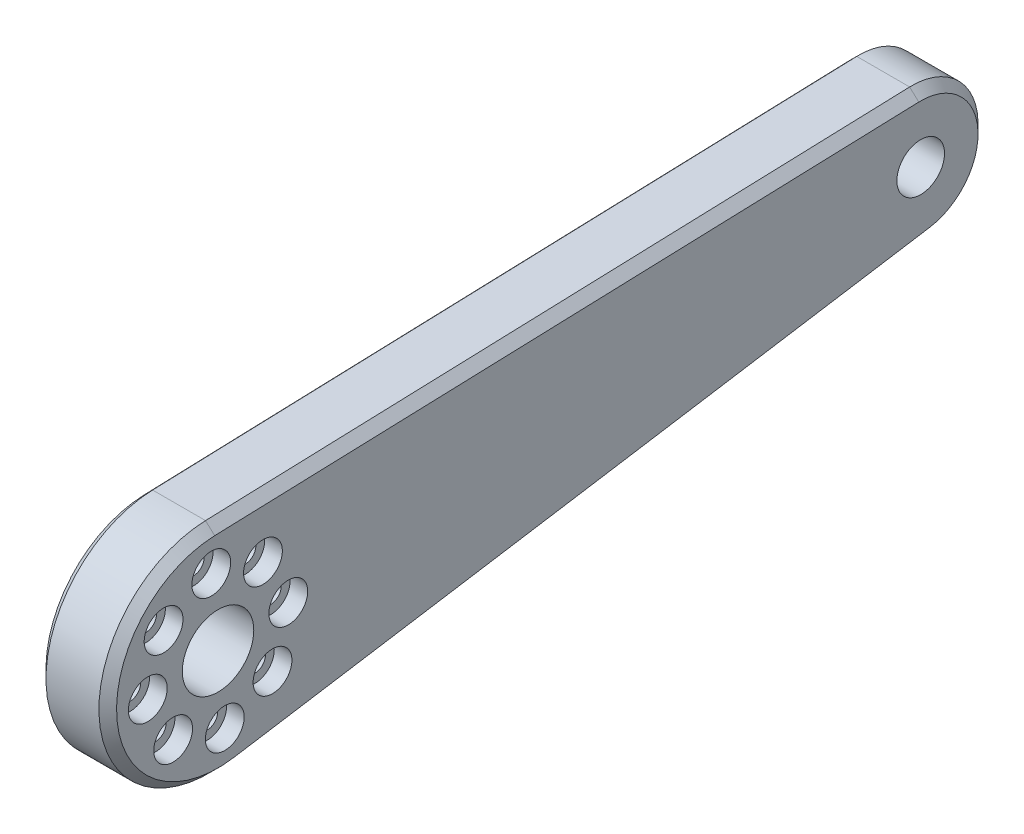
ISO-10303-21;
HEADER;
FILE_DESCRIPTION(('STEP AP214'),'2;1');
FILE_NAME('part.step','',(''),(''),'','','');
FILE_SCHEMA(('AUTOMOTIVE_DESIGN { 1 0 10303 214 1 1 1 1 }'));
ENDSEC;
DATA;
#1=APPLICATION_CONTEXT('core data for automotive mechanical design processes');
#2=APPLICATION_PROTOCOL_DEFINITION('international standard','automotive_design',2000,#1);
#3=PRODUCT_CONTEXT('',#1,'mechanical');
#4=PRODUCT('Part','Part','',(#3));
#5=PRODUCT_RELATED_PRODUCT_CATEGORY('part','',(#4));
#6=PRODUCT_DEFINITION_FORMATION('','',#4);
#7=PRODUCT_DEFINITION_CONTEXT('part definition',#1,'design');
#8=PRODUCT_DEFINITION('design','',#6,#7);
#9=PRODUCT_DEFINITION_SHAPE('','',#8);
#10=(LENGTH_UNIT() NAMED_UNIT(*) SI_UNIT(.MILLI.,.METRE.));
#11=(NAMED_UNIT(*) PLANE_ANGLE_UNIT() SI_UNIT($,.RADIAN.));
#12=(NAMED_UNIT(*) SI_UNIT($,.STERADIAN.) SOLID_ANGLE_UNIT());
#13=UNCERTAINTY_MEASURE_WITH_UNIT(LENGTH_MEASURE(1.E-05),#10,'distance_accuracy_value','');
#14=(GEOMETRIC_REPRESENTATION_CONTEXT(3) GLOBAL_UNCERTAINTY_ASSIGNED_CONTEXT((#13)) GLOBAL_UNIT_ASSIGNED_CONTEXT((#10,
#11,#12)) REPRESENTATION_CONTEXT('',''));
#15=CARTESIAN_POINT('',(0.,0.,0.));
#16=DIRECTION('',(0.,0.,1.));
#17=DIRECTION('',(1.,0.,0.));
#18=AXIS2_PLACEMENT_3D('',#15,#16,#17);
#19=CARTESIAN_POINT('',(8.,0.,0.));
#20=DIRECTION('',(1.,0.,0.));
#21=DIRECTION('',(0.,0.,-1.));
#22=AXIS2_PLACEMENT_3D('',#19,#20,#21);
#23=PLANE('',#22);
#24=CARTESIAN_POINT('',(8.,0.,0.));
#25=DIRECTION('',(1.,0.,0.));
#26=DIRECTION('',(0.,0.,-1.));
#27=AXIS2_PLACEMENT_3D('',#24,#25,#26);
#28=CIRCLE('',#27,11.5);
#29=CARTESIAN_POINT('',(8.,11.4936095629883,0.38332651041252));
#30=VERTEX_POINT('',#29);
#31=CARTESIAN_POINT('',(8.,-11.3559936016208,-1.81422416474595));
#32=VERTEX_POINT('',#31);
#33=EDGE_CURVE('E61',#30,#32,#28,.T.);
#34=ORIENTED_EDGE('',*,*,#33,.T.);
#35=DIRECTION('',(0.,0.157758623021387,-0.987477704488763));
#36=VECTOR('',#35,1.);
#37=CARTESIAN_POINT('',(8.,1.2400223360567,-80.6579961603689));
#38=LINE('',#37,#36);
#39=CARTESIAN_POINT('',(8.,1.24002233605671,-80.6579961603689));
#40=VERTEX_POINT('',#39);
#41=EDGE_CURVE('E11',#32,#40,#38,.T.);
#42=ORIENTED_EDGE('',*,*,#41,.T.);
#43=CARTESIAN_POINT('',(8.,7.65862741523368,-79.6325651107299));
#44=DIRECTION('',(1.,0.,0.));
#45=DIRECTION('',(0.,0.,-1.));
#46=AXIS2_PLACEMENT_3D('',#43,#44,#45);
#47=CIRCLE('',#46,6.50000000000002);
#48=CARTESIAN_POINT('',(8.,14.1550154290966,-79.4159023004967));
#49=VERTEX_POINT('',#48);
#50=EDGE_CURVE('E46',#40,#49,#47,.T.);
#51=ORIENTED_EDGE('',*,*,#50,.T.);
#52=DIRECTION('',(0.,-0.0333327400358713,0.999444309825065));
#53=VECTOR('',#52,1.);
#54=CARTESIAN_POINT('',(8.,11.4936095629883,0.38332651041252));
#55=LINE('',#54,#53);
#56=EDGE_CURVE('E297',#49,#30,#55,.T.);
#57=ORIENTED_EDGE('',*,*,#56,.T.);
#58=EDGE_LOOP('',(#34,#42,#51,#57));
#59=FACE_BOUND('',#58,.T.);
#60=CARTESIAN_POINT('',(8.,0.765862741523368,-7.96325651107299));
#61=DIRECTION('',(1.,0.,0.));
#62=DIRECTION('',(0.,0.,-1.));
#63=AXIS2_PLACEMENT_3D('',#60,#61,#62);
#64=CIRCLE('',#63,2.2);
#65=CARTESIAN_POINT('',(8.,0.765862741523368,-10.163256511073));
#66=VERTEX_POINT('',#65);
#67=EDGE_CURVE('E159',#66,#66,#64,.T.);
#68=ORIENTED_EDGE('',*,*,#67,.F.);
#69=EDGE_LOOP('',(#68));
#70=FACE_BOUND('',#69,.T.);
#71=CARTESIAN_POINT('',(8.,-5.08932594131834,-6.17241941729693));
#72=DIRECTION('',(1.,0.,0.));
#73=DIRECTION('',(0.,0.,-1.));
#74=AXIS2_PLACEMENT_3D('',#71,#72,#73);
#75=CIRCLE('',#74,2.2);
#76=CARTESIAN_POINT('',(8.,-5.08932594131834,-8.37241941729693));
#77=VERTEX_POINT('',#76);
#78=EDGE_CURVE('E178',#77,#77,#75,.T.);
#79=ORIENTED_EDGE('',*,*,#78,.F.);
#80=EDGE_LOOP('',(#79));
#81=FACE_BOUND('',#80,.T.);
#82=CARTESIAN_POINT('',(8.,-7.96325651107299,-0.765862741523369));
#83=DIRECTION('',(1.,0.,0.));
#84=DIRECTION('',(0.,0.,-1.));
#85=AXIS2_PLACEMENT_3D('',#82,#83,#84);
#86=CIRCLE('',#85,2.2);
#87=CARTESIAN_POINT('',(8.,-7.96325651107299,-2.96586274152337));
#88=VERTEX_POINT('',#87);
#89=EDGE_CURVE('E190',#88,#88,#86,.T.);
#90=ORIENTED_EDGE('',*,*,#89,.F.);
#91=EDGE_LOOP('',(#90));
#92=FACE_BOUND('',#91,.T.);
#93=CARTESIAN_POINT('',(8.,-6.17241941729693,5.08932594131834));
#94=DIRECTION('',(1.,0.,0.));
#95=DIRECTION('',(0.,0.,-1.));
#96=AXIS2_PLACEMENT_3D('',#93,#94,#95);
#97=CIRCLE('',#96,2.2);
#98=CARTESIAN_POINT('',(8.,-6.17241941729693,2.88932594131834));
#99=VERTEX_POINT('',#98);
#100=EDGE_CURVE('E202',#99,#99,#97,.T.);
#101=ORIENTED_EDGE('',*,*,#100,.F.);
#102=EDGE_LOOP('',(#101));
#103=FACE_BOUND('',#102,.T.);
#104=CARTESIAN_POINT('',(8.,-0.765862741523369,7.96325651107299));
#105=DIRECTION('',(1.,0.,0.));
#106=DIRECTION('',(0.,0.,-1.));
#107=AXIS2_PLACEMENT_3D('',#104,#105,#106);
#108=CIRCLE('',#107,2.2);
#109=CARTESIAN_POINT('',(8.,-0.765862741523369,5.76325651107299));
#110=VERTEX_POINT('',#109);
#111=EDGE_CURVE('E214',#110,#110,#108,.T.);
#112=ORIENTED_EDGE('',*,*,#111,.F.);
#113=EDGE_LOOP('',(#112));
#114=FACE_BOUND('',#113,.T.);
#115=CARTESIAN_POINT('',(8.,5.08932594131834,6.17241941729693));
#116=DIRECTION('',(1.,0.,0.));
#117=DIRECTION('',(0.,0.,-1.));
#118=AXIS2_PLACEMENT_3D('',#115,#116,#117);
#119=CIRCLE('',#118,2.2);
#120=CARTESIAN_POINT('',(8.,5.08932594131834,3.97241941729693));
#121=VERTEX_POINT('',#120);
#122=EDGE_CURVE('E226',#121,#121,#119,.T.);
#123=ORIENTED_EDGE('',*,*,#122,.F.);
#124=EDGE_LOOP('',(#123));
#125=FACE_BOUND('',#124,.T.);
#126=CARTESIAN_POINT('',(8.,7.96325651107299,0.76586274152337));
#127=DIRECTION('',(1.,0.,0.));
#128=DIRECTION('',(0.,0.,-1.));
#129=AXIS2_PLACEMENT_3D('',#126,#127,#128);
#130=CIRCLE('',#129,2.2);
#131=CARTESIAN_POINT('',(8.,7.96325651107299,-1.43413725847663));
#132=VERTEX_POINT('',#131);
#133=EDGE_CURVE('E238',#132,#132,#130,.T.);
#134=ORIENTED_EDGE('',*,*,#133,.F.);
#135=EDGE_LOOP('',(#134));
#136=FACE_BOUND('',#135,.T.);
#137=CARTESIAN_POINT('',(8.,6.17241941729693,-5.08932594131834));
#138=DIRECTION('',(1.,0.,0.));
#139=DIRECTION('',(0.,0.,-1.));
#140=AXIS2_PLACEMENT_3D('',#137,#138,#139);
#141=CIRCLE('',#140,2.2);
#142=CARTESIAN_POINT('',(8.,6.17241941729693,-7.28932594131834));
#143=VERTEX_POINT('',#142);
#144=EDGE_CURVE('E250',#143,#143,#141,.T.);
#145=ORIENTED_EDGE('',*,*,#144,.F.);
#146=EDGE_LOOP('',(#145));
#147=FACE_BOUND('',#146,.T.);
#148=CARTESIAN_POINT('',(8.,7.65862741523368,-79.6325651107299));
#149=DIRECTION('',(1.,0.,0.));
#150=DIRECTION('',(0.,0.,-1.));
#151=AXIS2_PLACEMENT_3D('',#148,#149,#150);
#152=CIRCLE('',#151,2.7);
#153=CARTESIAN_POINT('',(8.,7.65862741523368,-82.3325651107298));
#154=VERTEX_POINT('',#153);
#155=EDGE_CURVE('E269',#154,#154,#152,.T.);
#156=ORIENTED_EDGE('',*,*,#155,.F.);
#157=EDGE_LOOP('',(#156));
#158=FACE_BOUND('',#157,.T.);
#159=CARTESIAN_POINT('',(8.,0.,0.));
#160=DIRECTION('',(1.,0.,0.));
#161=DIRECTION('',(0.,0.,-1.));
#162=AXIS2_PLACEMENT_3D('',#159,#160,#161);
#163=CIRCLE('',#162,4.05);
#164=CARTESIAN_POINT('',(8.,0.,-4.05));
#165=VERTEX_POINT('',#164);
#166=EDGE_CURVE('E263',#165,#165,#163,.T.);
#167=ORIENTED_EDGE('',*,*,#166,.F.);
#168=EDGE_LOOP('',(#167));
#169=FACE_BOUND('',#168,.T.);
#170=ADVANCED_FACE('F36',(#59,#70,#81,#92,#103,#114,#125,#136,#147,#158,#169),#23,.T.);
#171=CARTESIAN_POINT('',(0.,0.,0.));
#172=DIRECTION('',(1.,0.,0.));
#173=DIRECTION('',(0.,0.,-1.));
#174=AXIS2_PLACEMENT_3D('',#171,#172,#173);
#175=PLANE('',#174);
#176=CARTESIAN_POINT('',(0.,7.65862741523368,-79.6325651107299));
#177=DIRECTION('',(1.,0.,0.));
#178=DIRECTION('',(0.,0.,-1.));
#179=AXIS2_PLACEMENT_3D('',#176,#177,#178);
#180=CIRCLE('',#179,6.50000000000001);
#181=CARTESIAN_POINT('',(0.,14.1550154290966,-79.4159023004967));
#182=VERTEX_POINT('',#181);
#183=CARTESIAN_POINT('',(0.,1.24002233605672,-80.6579961603689));
#184=VERTEX_POINT('',#183);
#185=EDGE_CURVE('E284',#182,#184,#180,.F.);
#186=ORIENTED_EDGE('',*,*,#185,.T.);
#187=DIRECTION('',(0.,-0.157758623021387,0.987477704488763));
#188=VECTOR('',#187,1.);
#189=CARTESIAN_POINT('',(0.,-11.3559936016208,-1.81422416474595));
#190=LINE('',#189,#188);
#191=CARTESIAN_POINT('',(0.,-11.3559936016208,-1.81422416474595));
#192=VERTEX_POINT('',#191);
#193=EDGE_CURVE('E117',#184,#192,#190,.T.);
#194=ORIENTED_EDGE('',*,*,#193,.T.);
#195=CARTESIAN_POINT('',(0.,0.,0.));
#196=DIRECTION('',(1.,0.,0.));
#197=DIRECTION('',(0.,0.,-1.));
#198=AXIS2_PLACEMENT_3D('',#195,#196,#197);
#199=CIRCLE('',#198,11.5);
#200=CARTESIAN_POINT('',(0.,11.4936095629883,0.38332651041252));
#201=VERTEX_POINT('',#200);
#202=EDGE_CURVE('E282',#192,#201,#199,.F.);
#203=ORIENTED_EDGE('',*,*,#202,.T.);
#204=DIRECTION('',(0.,0.0333327400358713,-0.999444309825065));
#205=VECTOR('',#204,1.);
#206=CARTESIAN_POINT('',(0.,11.4936095629883,0.38332651041252));
#207=LINE('',#206,#205);
#208=EDGE_CURVE('E280',#201,#182,#207,.T.);
#209=ORIENTED_EDGE('',*,*,#208,.T.);
#210=EDGE_LOOP('',(#186,#194,#203,#209));
#211=FACE_BOUND('',#210,.T.);
#212=CARTESIAN_POINT('',(0.,0.765862741523368,-7.96325651107299));
#213=DIRECTION('',(1.,0.,0.));
#214=DIRECTION('',(0.,0.,-1.));
#215=AXIS2_PLACEMENT_3D('',#212,#213,#214);
#216=CIRCLE('',#215,1.2);
#217=CARTESIAN_POINT('',(0.,0.765862741523368,-9.16325651107299));
#218=VERTEX_POINT('',#217);
#219=EDGE_CURVE('E175',#218,#218,#216,.T.);
#220=ORIENTED_EDGE('',*,*,#219,.T.);
#221=EDGE_LOOP('',(#220));
#222=FACE_BOUND('',#221,.T.);
#223=CARTESIAN_POINT('',(0.,-5.08932594131834,-6.17241941729693));
#224=DIRECTION('',(1.,0.,0.));
#225=DIRECTION('',(0.,0.,-1.));
#226=AXIS2_PLACEMENT_3D('',#223,#224,#225);
#227=CIRCLE('',#226,1.2);
#228=CARTESIAN_POINT('',(0.,-5.08932594131834,-7.37241941729693));
#229=VERTEX_POINT('',#228);
#230=EDGE_CURVE('E187',#229,#229,#227,.T.);
#231=ORIENTED_EDGE('',*,*,#230,.T.);
#232=EDGE_LOOP('',(#231));
#233=FACE_BOUND('',#232,.T.);
#234=CARTESIAN_POINT('',(0.,-7.96325651107299,-0.765862741523369));
#235=DIRECTION('',(1.,0.,0.));
#236=DIRECTION('',(0.,0.,-1.));
#237=AXIS2_PLACEMENT_3D('',#234,#235,#236);
#238=CIRCLE('',#237,1.2);
#239=CARTESIAN_POINT('',(0.,-7.96325651107299,-1.96586274152337));
#240=VERTEX_POINT('',#239);
#241=EDGE_CURVE('E199',#240,#240,#238,.T.);
#242=ORIENTED_EDGE('',*,*,#241,.T.);
#243=EDGE_LOOP('',(#242));
#244=FACE_BOUND('',#243,.T.);
#245=CARTESIAN_POINT('',(0.,-6.17241941729693,5.08932594131834));
#246=DIRECTION('',(1.,0.,0.));
#247=DIRECTION('',(0.,0.,-1.));
#248=AXIS2_PLACEMENT_3D('',#245,#246,#247);
#249=CIRCLE('',#248,1.2);
#250=CARTESIAN_POINT('',(0.,-6.17241941729693,3.88932594131834));
#251=VERTEX_POINT('',#250);
#252=EDGE_CURVE('E211',#251,#251,#249,.T.);
#253=ORIENTED_EDGE('',*,*,#252,.T.);
#254=EDGE_LOOP('',(#253));
#255=FACE_BOUND('',#254,.T.);
#256=CARTESIAN_POINT('',(0.,-0.765862741523369,7.96325651107299));
#257=DIRECTION('',(1.,0.,0.));
#258=DIRECTION('',(0.,0.,-1.));
#259=AXIS2_PLACEMENT_3D('',#256,#257,#258);
#260=CIRCLE('',#259,1.2);
#261=CARTESIAN_POINT('',(0.,-0.765862741523369,6.76325651107299));
#262=VERTEX_POINT('',#261);
#263=EDGE_CURVE('E223',#262,#262,#260,.T.);
#264=ORIENTED_EDGE('',*,*,#263,.T.);
#265=EDGE_LOOP('',(#264));
#266=FACE_BOUND('',#265,.T.);
#267=CARTESIAN_POINT('',(0.,5.08932594131834,6.17241941729693));
#268=DIRECTION('',(1.,0.,0.));
#269=DIRECTION('',(0.,0.,-1.));
#270=AXIS2_PLACEMENT_3D('',#267,#268,#269);
#271=CIRCLE('',#270,1.2);
#272=CARTESIAN_POINT('',(0.,5.08932594131834,4.97241941729693));
#273=VERTEX_POINT('',#272);
#274=EDGE_CURVE('E235',#273,#273,#271,.T.);
#275=ORIENTED_EDGE('',*,*,#274,.T.);
#276=EDGE_LOOP('',(#275));
#277=FACE_BOUND('',#276,.T.);
#278=CARTESIAN_POINT('',(0.,7.96325651107299,0.76586274152337));
#279=DIRECTION('',(1.,0.,0.));
#280=DIRECTION('',(0.,0.,-1.));
#281=AXIS2_PLACEMENT_3D('',#278,#279,#280);
#282=CIRCLE('',#281,1.2);
#283=CARTESIAN_POINT('',(0.,7.96325651107299,-0.434137258476628));
#284=VERTEX_POINT('',#283);
#285=EDGE_CURVE('E247',#284,#284,#282,.T.);
#286=ORIENTED_EDGE('',*,*,#285,.T.);
#287=EDGE_LOOP('',(#286));
#288=FACE_BOUND('',#287,.T.);
#289=CARTESIAN_POINT('',(0.,6.17241941729693,-5.08932594131834));
#290=DIRECTION('',(1.,0.,0.));
#291=DIRECTION('',(0.,0.,-1.));
#292=AXIS2_PLACEMENT_3D('',#289,#290,#291);
#293=CIRCLE('',#292,1.2);
#294=CARTESIAN_POINT('',(0.,6.17241941729693,-6.28932594131834));
#295=VERTEX_POINT('',#294);
#296=EDGE_CURVE('E259',#295,#295,#293,.T.);
#297=ORIENTED_EDGE('',*,*,#296,.T.);
#298=EDGE_LOOP('',(#297));
#299=FACE_BOUND('',#298,.T.);
#300=CARTESIAN_POINT('',(0.,7.65862741523368,-79.6325651107299));
#301=DIRECTION('',(1.,0.,0.));
#302=DIRECTION('',(0.,0.,-1.));
#303=AXIS2_PLACEMENT_3D('',#300,#301,#302);
#304=CIRCLE('',#303,2.7);
#305=CARTESIAN_POINT('',(0.,7.65862741523368,-82.3325651107298));
#306=VERTEX_POINT('',#305);
#307=EDGE_CURVE('E266',#306,#306,#304,.T.);
#308=ORIENTED_EDGE('',*,*,#307,.T.);
#309=EDGE_LOOP('',(#308));
#310=FACE_BOUND('',#309,.T.);
#311=CARTESIAN_POINT('',(0.,0.,0.));
#312=DIRECTION('',(1.,0.,0.));
#313=DIRECTION('',(0.,0.,-1.));
#314=AXIS2_PLACEMENT_3D('',#311,#312,#313);
#315=CIRCLE('',#314,4.05);
#316=CARTESIAN_POINT('',(0.,0.,-4.05));
#317=VERTEX_POINT('',#316);
#318=EDGE_CURVE('E262',#317,#317,#315,.T.);
#319=ORIENTED_EDGE('',*,*,#318,.T.);
#320=EDGE_LOOP('',(#319));
#321=FACE_BOUND('',#320,.T.);
#322=ADVANCED_FACE('F328',(#211,#222,#233,#244,#255,#266,#277,#288,#299,#310,#321),#175,.F.);
#323=CARTESIAN_POINT('',(8.,0.,0.));
#324=DIRECTION('',(-1.,0.,0.));
#325=DIRECTION('',(0.,0.,1.));
#326=AXIS2_PLACEMENT_3D('',#323,#324,#325);
#327=CYLINDRICAL_SURFACE('',#326,12.5);
#328=DIRECTION('',(-1.,0.,0.));
#329=VECTOR('',#328,1.);
#330=CARTESIAN_POINT('',(8.,12.4930538728133,0.416659250448391));
#331=LINE('',#330,#329);
#332=CARTESIAN_POINT('',(7.00000000000001,12.4930538728133,0.416659250448391));
#333=VERTEX_POINT('',#332);
#334=CARTESIAN_POINT('',(1.,12.4930538728133,0.416659250448391));
#335=VERTEX_POINT('',#334);
#336=EDGE_CURVE('E272',#333,#335,#331,.T.);
#337=ORIENTED_EDGE('',*,*,#336,.T.);
#338=CARTESIAN_POINT('',(1.,0.,0.));
#339=DIRECTION('',(1.,0.,0.));
#340=DIRECTION('',(0.,0.,-1.));
#341=AXIS2_PLACEMENT_3D('',#338,#339,#340);
#342=CIRCLE('',#341,12.5);
#343=CARTESIAN_POINT('',(1.,-12.3434713061095,-1.97198278776734));
#344=VERTEX_POINT('',#343);
#345=EDGE_CURVE('E291',#335,#344,#342,.T.);
#346=ORIENTED_EDGE('',*,*,#345,.T.);
#347=DIRECTION('',(-1.,0.,0.));
#348=VECTOR('',#347,1.);
#349=CARTESIAN_POINT('',(8.,-12.3434713061095,-1.97198278776734));
#350=LINE('',#349,#348);
#351=CARTESIAN_POINT('',(7.00000000000001,-12.3434713061095,-1.97198278776734));
#352=VERTEX_POINT('',#351);
#353=EDGE_CURVE('E128',#352,#344,#350,.T.);
#354=ORIENTED_EDGE('',*,*,#353,.F.);
#355=CARTESIAN_POINT('',(7.00000000000001,0.,0.));
#356=DIRECTION('',(1.,0.,0.));
#357=DIRECTION('',(0.,0.,-1.));
#358=AXIS2_PLACEMENT_3D('',#355,#356,#357);
#359=CIRCLE('',#358,12.5);
#360=EDGE_CURVE('E289',#352,#333,#359,.F.);
#361=ORIENTED_EDGE('',*,*,#360,.T.);
#362=EDGE_LOOP('',(#337,#346,#354,#361));
#363=FACE_BOUND('',#362,.T.);
#364=ADVANCED_FACE('F306',(#363),#327,.T.);
#365=CARTESIAN_POINT('',(8.,-12.3434713061095,-1.97198278776734));
#366=DIRECTION('',(0.,0.987477704488762,0.157758623021387));
#367=DIRECTION('',(0.,-0.157758623021387,0.987477704488763));
#368=AXIS2_PLACEMENT_3D('',#365,#366,#367);
#369=PLANE('',#368);
#370=ORIENTED_EDGE('',*,*,#353,.T.);
#371=DIRECTION('',(0.,0.157758623021387,-0.987477704488763));
#372=VECTOR('',#371,1.);
#373=CARTESIAN_POINT('',(0.999999999999999,-12.3434713061095,-1.97198278776734));
#374=LINE('',#373,#372);
#375=CARTESIAN_POINT('',(1.,0.252544631567964,-80.8157547833903));
#376=VERTEX_POINT('',#375);
#377=EDGE_CURVE('E127',#344,#376,#374,.T.);
#378=ORIENTED_EDGE('',*,*,#377,.T.);
#379=DIRECTION('',(-1.,0.,0.));
#380=VECTOR('',#379,1.);
#381=CARTESIAN_POINT('',(8.,0.252544631567964,-80.8157547833903));
#382=LINE('',#381,#380);
#383=CARTESIAN_POINT('',(7.00000000000001,0.252544631567964,-80.8157547833903));
#384=VERTEX_POINT('',#383);
#385=EDGE_CURVE('E110',#384,#376,#382,.T.);
#386=ORIENTED_EDGE('',*,*,#385,.F.);
#387=DIRECTION('',(0.,-0.157758623021387,0.987477704488763));
#388=VECTOR('',#387,1.);
#389=CARTESIAN_POINT('',(7.00000000000001,-12.3434713061095,-1.97198278776734));
#390=LINE('',#389,#388);
#391=EDGE_CURVE('E124',#384,#352,#390,.T.);
#392=ORIENTED_EDGE('',*,*,#391,.T.);
#393=EDGE_LOOP('',(#370,#378,#386,#392));
#394=FACE_BOUND('',#393,.T.);
#395=ADVANCED_FACE('F123',(#394),#369,.F.);
#396=CARTESIAN_POINT('',(8.,7.65862741523368,-79.6325651107299));
#397=DIRECTION('',(-1.,0.,0.));
#398=DIRECTION('',(0.,0.,1.));
#399=AXIS2_PLACEMENT_3D('',#396,#397,#398);
#400=CYLINDRICAL_SURFACE('',#399,7.5);
#401=ORIENTED_EDGE('',*,*,#385,.T.);
#402=CARTESIAN_POINT('',(1.,7.65862741523368,-79.6325651107299));
#403=DIRECTION('',(1.,0.,0.));
#404=DIRECTION('',(0.,0.,-1.));
#405=AXIS2_PLACEMENT_3D('',#402,#403,#404);
#406=CIRCLE('',#405,7.5);
#407=CARTESIAN_POINT('',(1.,15.1544597389217,-79.3825695604608));
#408=VERTEX_POINT('',#407);
#409=EDGE_CURVE('E116',#376,#408,#406,.T.);
#410=ORIENTED_EDGE('',*,*,#409,.T.);
#411=DIRECTION('',(-1.,0.,0.));
#412=VECTOR('',#411,1.);
#413=CARTESIAN_POINT('',(8.,15.1544597389217,-79.3825695604608));
#414=LINE('',#413,#412);
#415=CARTESIAN_POINT('',(7.00000000000001,15.1544597389217,-79.3825695604608));
#416=VERTEX_POINT('',#415);
#417=EDGE_CURVE('E112',#416,#408,#414,.T.);
#418=ORIENTED_EDGE('',*,*,#417,.F.);
#419=CARTESIAN_POINT('',(7.00000000000001,7.65862741523368,-79.6325651107299));
#420=DIRECTION('',(1.,0.,0.));
#421=DIRECTION('',(0.,0.,-1.));
#422=AXIS2_PLACEMENT_3D('',#419,#420,#421);
#423=CIRCLE('',#422,7.5);
#424=EDGE_CURVE('E107',#416,#384,#423,.F.);
#425=ORIENTED_EDGE('',*,*,#424,.T.);
#426=EDGE_LOOP('',(#401,#410,#418,#425));
#427=FACE_BOUND('',#426,.T.);
#428=ADVANCED_FACE('F109',(#427),#400,.T.);
#429=CARTESIAN_POINT('',(8.,12.4930538728133,0.416659250448391));
#430=DIRECTION('',(0.,-0.999444309825065,-0.0333327400358713));
#431=DIRECTION('',(0.,0.0333327400358713,-0.999444309825065));
#432=AXIS2_PLACEMENT_3D('',#429,#430,#431);
#433=PLANE('',#432);
#434=ORIENTED_EDGE('',*,*,#417,.T.);
#435=DIRECTION('',(0.,-0.0333327400358713,0.999444309825065));
#436=VECTOR('',#435,1.);
#437=CARTESIAN_POINT('',(1.,12.4930538728133,0.416659250448391));
#438=LINE('',#437,#436);
#439=EDGE_CURVE('E295',#408,#335,#438,.T.);
#440=ORIENTED_EDGE('',*,*,#439,.T.);
#441=ORIENTED_EDGE('',*,*,#336,.F.);
#442=DIRECTION('',(0.,0.0333327400358713,-0.999444309825065));
#443=VECTOR('',#442,1.);
#444=CARTESIAN_POINT('',(7.00000000000001,15.1544597389217,-79.3825695604608));
#445=LINE('',#444,#443);
#446=EDGE_CURVE('E293',#333,#416,#445,.T.);
#447=ORIENTED_EDGE('',*,*,#446,.T.);
#448=EDGE_LOOP('',(#434,#440,#441,#447));
#449=FACE_BOUND('',#448,.T.);
#450=ADVANCED_FACE('F308',(#449),#433,.F.);
#451=CARTESIAN_POINT('',(8.,7.65862741523368,-79.6325651107299));
#452=DIRECTION('',(-1.,0.,0.));
#453=DIRECTION('',(0.,0.,1.));
#454=AXIS2_PLACEMENT_3D('',#451,#452,#453);
#455=CYLINDRICAL_SURFACE('',#454,2.7);
#456=ORIENTED_EDGE('',*,*,#155,.T.);
#457=EDGE_LOOP('',(#456));
#458=FACE_BOUND('',#457,.T.);
#459=ORIENTED_EDGE('',*,*,#307,.F.);
#460=EDGE_LOOP('',(#459));
#461=FACE_BOUND('',#460,.T.);
#462=ADVANCED_FACE('F337',(#458,#461),#455,.F.);
#463=CARTESIAN_POINT('',(8.,0.,0.));
#464=DIRECTION('',(-1.,0.,0.));
#465=DIRECTION('',(0.,0.,1.));
#466=AXIS2_PLACEMENT_3D('',#463,#464,#465);
#467=CYLINDRICAL_SURFACE('',#466,4.05);
#468=ORIENTED_EDGE('',*,*,#166,.T.);
#469=EDGE_LOOP('',(#468));
#470=FACE_BOUND('',#469,.T.);
#471=ORIENTED_EDGE('',*,*,#318,.F.);
#472=EDGE_LOOP('',(#471));
#473=FACE_BOUND('',#472,.T.);
#474=ADVANCED_FACE('F374',(#470,#473),#467,.F.);
#475=CARTESIAN_POINT('',(8.,6.17241941729693,-5.08932594131834));
#476=DIRECTION('',(1.,0.,0.));
#477=DIRECTION('',(0.,0.,-1.));
#478=AXIS2_PLACEMENT_3D('',#475,#476,#477);
#479=CYLINDRICAL_SURFACE('',#478,1.2);
#480=ORIENTED_EDGE('',*,*,#296,.F.);
#481=EDGE_LOOP('',(#480));
#482=FACE_BOUND('',#481,.T.);
#483=CARTESIAN_POINT('',(6.,6.17241941729693,-5.08932594131834));
#484=DIRECTION('',(1.,0.,0.));
#485=DIRECTION('',(0.,0.,-1.));
#486=AXIS2_PLACEMENT_3D('',#483,#484,#485);
#487=CIRCLE('',#486,1.2);
#488=CARTESIAN_POINT('',(6.,6.17241941729693,-6.28932594131834));
#489=VERTEX_POINT('',#488);
#490=EDGE_CURVE('E256',#489,#489,#487,.T.);
#491=ORIENTED_EDGE('',*,*,#490,.T.);
#492=EDGE_LOOP('',(#491));
#493=FACE_BOUND('',#492,.T.);
#494=ADVANCED_FACE('F382',(#482,#493),#479,.F.);
#495=CARTESIAN_POINT('',(6.,7.37241941729693,-5.08932594131834));
#496=DIRECTION('',(-1.,0.,0.));
#497=DIRECTION('',(0.,0.,1.));
#498=AXIS2_PLACEMENT_3D('',#495,#496,#497);
#499=PLANE('',#498);
#500=ORIENTED_EDGE('',*,*,#490,.F.);
#501=EDGE_LOOP('',(#500));
#502=FACE_BOUND('',#501,.T.);
#503=CARTESIAN_POINT('',(6.,6.17241941729693,-5.08932594131834));
#504=DIRECTION('',(1.,0.,0.));
#505=DIRECTION('',(0.,0.,-1.));
#506=AXIS2_PLACEMENT_3D('',#503,#504,#505);
#507=CIRCLE('',#506,2.2);
#508=CARTESIAN_POINT('',(6.,6.17241941729693,-7.28932594131834));
#509=VERTEX_POINT('',#508);
#510=EDGE_CURVE('E253',#509,#509,#507,.T.);
#511=ORIENTED_EDGE('',*,*,#510,.T.);
#512=EDGE_LOOP('',(#511));
#513=FACE_BOUND('',#512,.T.);
#514=ADVANCED_FACE('F390',(#502,#513),#499,.F.);
#515=CARTESIAN_POINT('',(8.,6.17241941729693,-5.08932594131834));
#516=DIRECTION('',(1.,0.,0.));
#517=DIRECTION('',(0.,0.,-1.));
#518=AXIS2_PLACEMENT_3D('',#515,#516,#517);
#519=CYLINDRICAL_SURFACE('',#518,2.2);
#520=ORIENTED_EDGE('',*,*,#510,.F.);
#521=EDGE_LOOP('',(#520));
#522=FACE_BOUND('',#521,.T.);
#523=ORIENTED_EDGE('',*,*,#144,.T.);
#524=EDGE_LOOP('',(#523));
#525=FACE_BOUND('',#524,.T.);
#526=ADVANCED_FACE('F399',(#522,#525),#519,.F.);
#527=CARTESIAN_POINT('',(8.,7.96325651107299,0.76586274152337));
#528=DIRECTION('',(1.,0.,0.));
#529=DIRECTION('',(0.,0.,-1.));
#530=AXIS2_PLACEMENT_3D('',#527,#528,#529);
#531=CYLINDRICAL_SURFACE('',#530,1.2);
#532=ORIENTED_EDGE('',*,*,#285,.F.);
#533=EDGE_LOOP('',(#532));
#534=FACE_BOUND('',#533,.T.);
#535=CARTESIAN_POINT('',(6.,7.96325651107299,0.76586274152337));
#536=DIRECTION('',(1.,0.,0.));
#537=DIRECTION('',(0.,0.,-1.));
#538=AXIS2_PLACEMENT_3D('',#535,#536,#537);
#539=CIRCLE('',#538,1.2);
#540=CARTESIAN_POINT('',(6.,7.96325651107299,-0.43413725847663));
#541=VERTEX_POINT('',#540);
#542=EDGE_CURVE('E244',#541,#541,#539,.T.);
#543=ORIENTED_EDGE('',*,*,#542,.T.);
#544=EDGE_LOOP('',(#543));
#545=FACE_BOUND('',#544,.T.);
#546=ADVANCED_FACE('F408',(#534,#545),#531,.F.);
#547=CARTESIAN_POINT('',(6.,9.16325651107299,0.76586274152337));
#548=DIRECTION('',(-1.,0.,0.));
#549=DIRECTION('',(0.,0.,1.));
#550=AXIS2_PLACEMENT_3D('',#547,#548,#549);
#551=PLANE('',#550);
#552=ORIENTED_EDGE('',*,*,#542,.F.);
#553=EDGE_LOOP('',(#552));
#554=FACE_BOUND('',#553,.T.);
#555=CARTESIAN_POINT('',(6.,7.96325651107299,0.76586274152337));
#556=DIRECTION('',(1.,0.,0.));
#557=DIRECTION('',(0.,0.,-1.));
#558=AXIS2_PLACEMENT_3D('',#555,#556,#557);
#559=CIRCLE('',#558,2.2);
#560=CARTESIAN_POINT('',(6.,7.96325651107299,-1.43413725847663));
#561=VERTEX_POINT('',#560);
#562=EDGE_CURVE('E241',#561,#561,#559,.T.);
#563=ORIENTED_EDGE('',*,*,#562,.T.);
#564=EDGE_LOOP('',(#563));
#565=FACE_BOUND('',#564,.T.);
#566=ADVANCED_FACE('F417',(#554,#565),#551,.F.);
#567=CARTESIAN_POINT('',(8.,7.96325651107299,0.76586274152337));
#568=DIRECTION('',(1.,0.,0.));
#569=DIRECTION('',(0.,0.,-1.));
#570=AXIS2_PLACEMENT_3D('',#567,#568,#569);
#571=CYLINDRICAL_SURFACE('',#570,2.2);
#572=ORIENTED_EDGE('',*,*,#562,.F.);
#573=EDGE_LOOP('',(#572));
#574=FACE_BOUND('',#573,.T.);
#575=ORIENTED_EDGE('',*,*,#133,.T.);
#576=EDGE_LOOP('',(#575));
#577=FACE_BOUND('',#576,.T.);
#578=ADVANCED_FACE('F426',(#574,#577),#571,.F.);
#579=CARTESIAN_POINT('',(8.,5.08932594131834,6.17241941729693));
#580=DIRECTION('',(1.,0.,0.));
#581=DIRECTION('',(0.,0.,-1.));
#582=AXIS2_PLACEMENT_3D('',#579,#580,#581);
#583=CYLINDRICAL_SURFACE('',#582,1.2);
#584=ORIENTED_EDGE('',*,*,#274,.F.);
#585=EDGE_LOOP('',(#584));
#586=FACE_BOUND('',#585,.T.);
#587=CARTESIAN_POINT('',(6.,5.08932594131834,6.17241941729693));
#588=DIRECTION('',(1.,0.,0.));
#589=DIRECTION('',(0.,0.,-1.));
#590=AXIS2_PLACEMENT_3D('',#587,#588,#589);
#591=CIRCLE('',#590,1.2);
#592=CARTESIAN_POINT('',(6.,5.08932594131834,4.97241941729693));
#593=VERTEX_POINT('',#592);
#594=EDGE_CURVE('E232',#593,#593,#591,.T.);
#595=ORIENTED_EDGE('',*,*,#594,.T.);
#596=EDGE_LOOP('',(#595));
#597=FACE_BOUND('',#596,.T.);
#598=ADVANCED_FACE('F435',(#586,#597),#583,.F.);
#599=CARTESIAN_POINT('',(6.,6.28932594131834,6.17241941729693));
#600=DIRECTION('',(-1.,0.,0.));
#601=DIRECTION('',(0.,0.,1.));
#602=AXIS2_PLACEMENT_3D('',#599,#600,#601);
#603=PLANE('',#602);
#604=ORIENTED_EDGE('',*,*,#594,.F.);
#605=EDGE_LOOP('',(#604));
#606=FACE_BOUND('',#605,.T.);
#607=CARTESIAN_POINT('',(6.,5.08932594131834,6.17241941729693));
#608=DIRECTION('',(1.,0.,0.));
#609=DIRECTION('',(0.,0.,-1.));
#610=AXIS2_PLACEMENT_3D('',#607,#608,#609);
#611=CIRCLE('',#610,2.2);
#612=CARTESIAN_POINT('',(6.,5.08932594131834,3.97241941729693));
#613=VERTEX_POINT('',#612);
#614=EDGE_CURVE('E229',#613,#613,#611,.T.);
#615=ORIENTED_EDGE('',*,*,#614,.T.);
#616=EDGE_LOOP('',(#615));
#617=FACE_BOUND('',#616,.T.);
#618=ADVANCED_FACE('F444',(#606,#617),#603,.F.);
#619=CARTESIAN_POINT('',(8.,5.08932594131834,6.17241941729693));
#620=DIRECTION('',(1.,0.,0.));
#621=DIRECTION('',(0.,0.,-1.));
#622=AXIS2_PLACEMENT_3D('',#619,#620,#621);
#623=CYLINDRICAL_SURFACE('',#622,2.2);
#624=ORIENTED_EDGE('',*,*,#614,.F.);
#625=EDGE_LOOP('',(#624));
#626=FACE_BOUND('',#625,.T.);
#627=ORIENTED_EDGE('',*,*,#122,.T.);
#628=EDGE_LOOP('',(#627));
#629=FACE_BOUND('',#628,.T.);
#630=ADVANCED_FACE('F453',(#626,#629),#623,.F.);
#631=CARTESIAN_POINT('',(8.,-0.765862741523369,7.96325651107299));
#632=DIRECTION('',(1.,0.,0.));
#633=DIRECTION('',(0.,0.,-1.));
#634=AXIS2_PLACEMENT_3D('',#631,#632,#633);
#635=CYLINDRICAL_SURFACE('',#634,1.2);
#636=ORIENTED_EDGE('',*,*,#263,.F.);
#637=EDGE_LOOP('',(#636));
#638=FACE_BOUND('',#637,.T.);
#639=CARTESIAN_POINT('',(6.,-0.765862741523369,7.96325651107299));
#640=DIRECTION('',(1.,0.,0.));
#641=DIRECTION('',(0.,0.,-1.));
#642=AXIS2_PLACEMENT_3D('',#639,#640,#641);
#643=CIRCLE('',#642,1.2);
#644=CARTESIAN_POINT('',(6.,-0.765862741523369,6.76325651107299));
#645=VERTEX_POINT('',#644);
#646=EDGE_CURVE('E220',#645,#645,#643,.T.);
#647=ORIENTED_EDGE('',*,*,#646,.T.);
#648=EDGE_LOOP('',(#647));
#649=FACE_BOUND('',#648,.T.);
#650=ADVANCED_FACE('F462',(#638,#649),#635,.F.);
#651=CARTESIAN_POINT('',(6.,0.43413725847663,7.96325651107299));
#652=DIRECTION('',(-1.,0.,0.));
#653=DIRECTION('',(0.,0.,1.));
#654=AXIS2_PLACEMENT_3D('',#651,#652,#653);
#655=PLANE('',#654);
#656=ORIENTED_EDGE('',*,*,#646,.F.);
#657=EDGE_LOOP('',(#656));
#658=FACE_BOUND('',#657,.T.);
#659=CARTESIAN_POINT('',(6.,-0.765862741523369,7.96325651107299));
#660=DIRECTION('',(1.,0.,0.));
#661=DIRECTION('',(0.,0.,-1.));
#662=AXIS2_PLACEMENT_3D('',#659,#660,#661);
#663=CIRCLE('',#662,2.2);
#664=CARTESIAN_POINT('',(6.,-0.765862741523369,5.76325651107299));
#665=VERTEX_POINT('',#664);
#666=EDGE_CURVE('E217',#665,#665,#663,.T.);
#667=ORIENTED_EDGE('',*,*,#666,.T.);
#668=EDGE_LOOP('',(#667));
#669=FACE_BOUND('',#668,.T.);
#670=ADVANCED_FACE('F471',(#658,#669),#655,.F.);
#671=CARTESIAN_POINT('',(8.,-0.765862741523369,7.96325651107299));
#672=DIRECTION('',(1.,0.,0.));
#673=DIRECTION('',(0.,0.,-1.));
#674=AXIS2_PLACEMENT_3D('',#671,#672,#673);
#675=CYLINDRICAL_SURFACE('',#674,2.2);
#676=ORIENTED_EDGE('',*,*,#666,.F.);
#677=EDGE_LOOP('',(#676));
#678=FACE_BOUND('',#677,.T.);
#679=ORIENTED_EDGE('',*,*,#111,.T.);
#680=EDGE_LOOP('',(#679));
#681=FACE_BOUND('',#680,.T.);
#682=ADVANCED_FACE('F480',(#678,#681),#675,.F.);
#683=CARTESIAN_POINT('',(8.,-6.17241941729693,5.08932594131834));
#684=DIRECTION('',(1.,0.,0.));
#685=DIRECTION('',(0.,0.,-1.));
#686=AXIS2_PLACEMENT_3D('',#683,#684,#685);
#687=CYLINDRICAL_SURFACE('',#686,1.2);
#688=ORIENTED_EDGE('',*,*,#252,.F.);
#689=EDGE_LOOP('',(#688));
#690=FACE_BOUND('',#689,.T.);
#691=CARTESIAN_POINT('',(6.,-6.17241941729693,5.08932594131834));
#692=DIRECTION('',(1.,0.,0.));
#693=DIRECTION('',(0.,0.,-1.));
#694=AXIS2_PLACEMENT_3D('',#691,#692,#693);
#695=CIRCLE('',#694,1.2);
#696=CARTESIAN_POINT('',(6.,-6.17241941729693,3.88932594131834));
#697=VERTEX_POINT('',#696);
#698=EDGE_CURVE('E208',#697,#697,#695,.T.);
#699=ORIENTED_EDGE('',*,*,#698,.T.);
#700=EDGE_LOOP('',(#699));
#701=FACE_BOUND('',#700,.T.);
#702=ADVANCED_FACE('F489',(#690,#701),#687,.F.);
#703=CARTESIAN_POINT('',(6.,-4.97241941729693,5.08932594131834));
#704=DIRECTION('',(-1.,0.,0.));
#705=DIRECTION('',(0.,0.,1.));
#706=AXIS2_PLACEMENT_3D('',#703,#704,#705);
#707=PLANE('',#706);
#708=ORIENTED_EDGE('',*,*,#698,.F.);
#709=EDGE_LOOP('',(#708));
#710=FACE_BOUND('',#709,.T.);
#711=CARTESIAN_POINT('',(6.,-6.17241941729693,5.08932594131834));
#712=DIRECTION('',(1.,0.,0.));
#713=DIRECTION('',(0.,0.,-1.));
#714=AXIS2_PLACEMENT_3D('',#711,#712,#713);
#715=CIRCLE('',#714,2.2);
#716=CARTESIAN_POINT('',(6.,-6.17241941729693,2.88932594131834));
#717=VERTEX_POINT('',#716);
#718=EDGE_CURVE('E205',#717,#717,#715,.T.);
#719=ORIENTED_EDGE('',*,*,#718,.T.);
#720=EDGE_LOOP('',(#719));
#721=FACE_BOUND('',#720,.T.);
#722=ADVANCED_FACE('F498',(#710,#721),#707,.F.);
#723=CARTESIAN_POINT('',(8.,-6.17241941729693,5.08932594131834));
#724=DIRECTION('',(1.,0.,0.));
#725=DIRECTION('',(0.,0.,-1.));
#726=AXIS2_PLACEMENT_3D('',#723,#724,#725);
#727=CYLINDRICAL_SURFACE('',#726,2.2);
#728=ORIENTED_EDGE('',*,*,#718,.F.);
#729=EDGE_LOOP('',(#728));
#730=FACE_BOUND('',#729,.T.);
#731=ORIENTED_EDGE('',*,*,#100,.T.);
#732=EDGE_LOOP('',(#731));
#733=FACE_BOUND('',#732,.T.);
#734=ADVANCED_FACE('F507',(#730,#733),#727,.F.);
#735=CARTESIAN_POINT('',(8.,-7.96325651107299,-0.765862741523369));
#736=DIRECTION('',(1.,0.,0.));
#737=DIRECTION('',(0.,0.,-1.));
#738=AXIS2_PLACEMENT_3D('',#735,#736,#737);
#739=CYLINDRICAL_SURFACE('',#738,1.2);
#740=ORIENTED_EDGE('',*,*,#241,.F.);
#741=EDGE_LOOP('',(#740));
#742=FACE_BOUND('',#741,.T.);
#743=CARTESIAN_POINT('',(6.,-7.96325651107299,-0.765862741523369));
#744=DIRECTION('',(1.,0.,0.));
#745=DIRECTION('',(0.,0.,-1.));
#746=AXIS2_PLACEMENT_3D('',#743,#744,#745);
#747=CIRCLE('',#746,1.2);
#748=CARTESIAN_POINT('',(6.,-7.96325651107299,-1.96586274152337));
#749=VERTEX_POINT('',#748);
#750=EDGE_CURVE('E196',#749,#749,#747,.T.);
#751=ORIENTED_EDGE('',*,*,#750,.T.);
#752=EDGE_LOOP('',(#751));
#753=FACE_BOUND('',#752,.T.);
#754=ADVANCED_FACE('F516',(#742,#753),#739,.F.);
#755=CARTESIAN_POINT('',(6.,-6.76325651107299,-0.765862741523369));
#756=DIRECTION('',(-1.,0.,0.));
#757=DIRECTION('',(0.,0.,1.));
#758=AXIS2_PLACEMENT_3D('',#755,#756,#757);
#759=PLANE('',#758);
#760=ORIENTED_EDGE('',*,*,#750,.F.);
#761=EDGE_LOOP('',(#760));
#762=FACE_BOUND('',#761,.T.);
#763=CARTESIAN_POINT('',(6.,-7.96325651107299,-0.765862741523369));
#764=DIRECTION('',(1.,0.,0.));
#765=DIRECTION('',(0.,0.,-1.));
#766=AXIS2_PLACEMENT_3D('',#763,#764,#765);
#767=CIRCLE('',#766,2.2);
#768=CARTESIAN_POINT('',(6.,-7.96325651107299,-2.96586274152337));
#769=VERTEX_POINT('',#768);
#770=EDGE_CURVE('E193',#769,#769,#767,.T.);
#771=ORIENTED_EDGE('',*,*,#770,.T.);
#772=EDGE_LOOP('',(#771));
#773=FACE_BOUND('',#772,.T.);
#774=ADVANCED_FACE('F525',(#762,#773),#759,.F.);
#775=CARTESIAN_POINT('',(8.,-7.96325651107299,-0.765862741523369));
#776=DIRECTION('',(1.,0.,0.));
#777=DIRECTION('',(0.,0.,-1.));
#778=AXIS2_PLACEMENT_3D('',#775,#776,#777);
#779=CYLINDRICAL_SURFACE('',#778,2.2);
#780=ORIENTED_EDGE('',*,*,#770,.F.);
#781=EDGE_LOOP('',(#780));
#782=FACE_BOUND('',#781,.T.);
#783=ORIENTED_EDGE('',*,*,#89,.T.);
#784=EDGE_LOOP('',(#783));
#785=FACE_BOUND('',#784,.T.);
#786=ADVANCED_FACE('F534',(#782,#785),#779,.F.);
#787=CARTESIAN_POINT('',(8.,-5.08932594131834,-6.17241941729693));
#788=DIRECTION('',(1.,0.,0.));
#789=DIRECTION('',(0.,0.,-1.));
#790=AXIS2_PLACEMENT_3D('',#787,#788,#789);
#791=CYLINDRICAL_SURFACE('',#790,1.2);
#792=ORIENTED_EDGE('',*,*,#230,.F.);
#793=EDGE_LOOP('',(#792));
#794=FACE_BOUND('',#793,.T.);
#795=CARTESIAN_POINT('',(6.,-5.08932594131834,-6.17241941729693));
#796=DIRECTION('',(1.,0.,0.));
#797=DIRECTION('',(0.,0.,-1.));
#798=AXIS2_PLACEMENT_3D('',#795,#796,#797);
#799=CIRCLE('',#798,1.2);
#800=CARTESIAN_POINT('',(6.,-5.08932594131834,-7.37241941729693));
#801=VERTEX_POINT('',#800);
#802=EDGE_CURVE('E184',#801,#801,#799,.T.);
#803=ORIENTED_EDGE('',*,*,#802,.T.);
#804=EDGE_LOOP('',(#803));
#805=FACE_BOUND('',#804,.T.);
#806=ADVANCED_FACE('F543',(#794,#805),#791,.F.);
#807=CARTESIAN_POINT('',(6.,-3.88932594131834,-6.17241941729693));
#808=DIRECTION('',(-1.,0.,0.));
#809=DIRECTION('',(0.,0.,1.));
#810=AXIS2_PLACEMENT_3D('',#807,#808,#809);
#811=PLANE('',#810);
#812=ORIENTED_EDGE('',*,*,#802,.F.);
#813=EDGE_LOOP('',(#812));
#814=FACE_BOUND('',#813,.T.);
#815=CARTESIAN_POINT('',(6.,-5.08932594131834,-6.17241941729693));
#816=DIRECTION('',(1.,0.,0.));
#817=DIRECTION('',(0.,0.,-1.));
#818=AXIS2_PLACEMENT_3D('',#815,#816,#817);
#819=CIRCLE('',#818,2.2);
#820=CARTESIAN_POINT('',(6.,-5.08932594131834,-8.37241941729693));
#821=VERTEX_POINT('',#820);
#822=EDGE_CURVE('E181',#821,#821,#819,.T.);
#823=ORIENTED_EDGE('',*,*,#822,.T.);
#824=EDGE_LOOP('',(#823));
#825=FACE_BOUND('',#824,.T.);
#826=ADVANCED_FACE('F552',(#814,#825),#811,.F.);
#827=CARTESIAN_POINT('',(8.,-5.08932594131834,-6.17241941729693));
#828=DIRECTION('',(1.,0.,0.));
#829=DIRECTION('',(0.,0.,-1.));
#830=AXIS2_PLACEMENT_3D('',#827,#828,#829);
#831=CYLINDRICAL_SURFACE('',#830,2.2);
#832=ORIENTED_EDGE('',*,*,#822,.F.);
#833=EDGE_LOOP('',(#832));
#834=FACE_BOUND('',#833,.T.);
#835=ORIENTED_EDGE('',*,*,#78,.T.);
#836=EDGE_LOOP('',(#835));
#837=FACE_BOUND('',#836,.T.);
#838=ADVANCED_FACE('F561',(#834,#837),#831,.F.);
#839=CARTESIAN_POINT('',(8.,0.765862741523368,-7.96325651107299));
#840=DIRECTION('',(1.,0.,0.));
#841=DIRECTION('',(0.,0.,-1.));
#842=AXIS2_PLACEMENT_3D('',#839,#840,#841);
#843=CYLINDRICAL_SURFACE('',#842,1.2);
#844=ORIENTED_EDGE('',*,*,#219,.F.);
#845=EDGE_LOOP('',(#844));
#846=FACE_BOUND('',#845,.T.);
#847=CARTESIAN_POINT('',(6.,0.765862741523368,-7.96325651107299));
#848=DIRECTION('',(1.,0.,0.));
#849=DIRECTION('',(0.,0.,-1.));
#850=AXIS2_PLACEMENT_3D('',#847,#848,#849);
#851=CIRCLE('',#850,1.2);
#852=CARTESIAN_POINT('',(6.,0.765862741523368,-9.16325651107299));
#853=VERTEX_POINT('',#852);
#854=EDGE_CURVE('E170',#853,#853,#851,.T.);
#855=ORIENTED_EDGE('',*,*,#854,.T.);
#856=EDGE_LOOP('',(#855));
#857=FACE_BOUND('',#856,.T.);
#858=ADVANCED_FACE('F570',(#846,#857),#843,.F.);
#859=CARTESIAN_POINT('',(6.,1.96586274152337,-7.96325651107299));
#860=DIRECTION('',(-1.,0.,0.));
#861=DIRECTION('',(0.,0.,1.));
#862=AXIS2_PLACEMENT_3D('',#859,#860,#861);
#863=PLANE('',#862);
#864=ORIENTED_EDGE('',*,*,#854,.F.);
#865=EDGE_LOOP('',(#864));
#866=FACE_BOUND('',#865,.T.);
#867=CARTESIAN_POINT('',(6.,0.765862741523368,-7.96325651107299));
#868=DIRECTION('',(1.,0.,0.));
#869=DIRECTION('',(0.,0.,-1.));
#870=AXIS2_PLACEMENT_3D('',#867,#868,#869);
#871=CIRCLE('',#870,2.2);
#872=CARTESIAN_POINT('',(6.,0.765862741523368,-10.163256511073));
#873=VERTEX_POINT('',#872);
#874=EDGE_CURVE('E165',#873,#873,#871,.T.);
#875=ORIENTED_EDGE('',*,*,#874,.T.);
#876=EDGE_LOOP('',(#875));
#877=FACE_BOUND('',#876,.T.);
#878=ADVANCED_FACE('F579',(#866,#877),#863,.F.);
#879=CARTESIAN_POINT('',(8.,0.765862741523368,-7.96325651107299));
#880=DIRECTION('',(1.,0.,0.));
#881=DIRECTION('',(0.,0.,-1.));
#882=AXIS2_PLACEMENT_3D('',#879,#880,#881);
#883=CYLINDRICAL_SURFACE('',#882,2.2);
#884=ORIENTED_EDGE('',*,*,#874,.F.);
#885=EDGE_LOOP('',(#884));
#886=FACE_BOUND('',#885,.T.);
#887=ORIENTED_EDGE('',*,*,#67,.T.);
#888=EDGE_LOOP('',(#887));
#889=FACE_BOUND('',#888,.T.);
#890=ADVANCED_FACE('F588',(#886,#889),#883,.F.);
#891=CARTESIAN_POINT('',(1.,12.4930538728133,0.416659250448391));
#892=DIRECTION('',(0.707106781186544,-0.706713848895616,-0.023569806514893));
#893=DIRECTION('',(0.,-0.0333327400358713,0.999444309825065));
#894=AXIS2_PLACEMENT_3D('',#891,#892,#893);
#895=PLANE('',#894);
#896=DIRECTION('',(0.707106781186551,0.706713848895609,0.0235698065148969));
#897=VECTOR('',#896,1.);
#898=CARTESIAN_POINT('',(0.,14.1550154290966,-79.4159023004967));
#899=LINE('',#898,#897);
#900=EDGE_CURVE('E151',#182,#408,#899,.T.);
#901=ORIENTED_EDGE('',*,*,#900,.F.);
#902=ORIENTED_EDGE('',*,*,#208,.F.);
#903=DIRECTION('',(-0.707106781186551,-0.706713848895609,-0.0235698065148928));
#904=VECTOR('',#903,1.);
#905=CARTESIAN_POINT('',(1.,12.4930538728133,0.416659250448391));
#906=LINE('',#905,#904);
#907=EDGE_CURVE('E139',#335,#201,#906,.T.);
#908=ORIENTED_EDGE('',*,*,#907,.F.);
#909=ORIENTED_EDGE('',*,*,#439,.F.);
#910=EDGE_LOOP('',(#901,#902,#908,#909));
#911=FACE_BOUND('',#910,.T.);
#912=ADVANCED_FACE('F311',(#911),#895,.F.);
#913=CARTESIAN_POINT('',(1.,0.,0.));
#914=DIRECTION('',(1.,0.,0.));
#915=DIRECTION('',(0.,0.,-1.));
#916=AXIS2_PLACEMENT_3D('',#913,#914,#915);
#917=CONICAL_SURFACE('',#916,12.5,0.785398163397443);
#918=ORIENTED_EDGE('',*,*,#907,.T.);
#919=ORIENTED_EDGE('',*,*,#202,.F.);
#920=DIRECTION('',(-0.707106781186551,0.698252181114526,0.111552192129074));
#921=VECTOR('',#920,1.);
#922=CARTESIAN_POINT('',(1.,-12.3434713061095,-1.97198278776733));
#923=LINE('',#922,#921);
#924=EDGE_CURVE('E145',#344,#192,#923,.T.);
#925=ORIENTED_EDGE('',*,*,#924,.F.);
#926=ORIENTED_EDGE('',*,*,#345,.F.);
#927=EDGE_LOOP('',(#918,#919,#925,#926));
#928=FACE_BOUND('',#927,.T.);
#929=ADVANCED_FACE('F314',(#928),#917,.T.);
#930=CARTESIAN_POINT('',(1.,7.65862741523368,-79.6325651107299));
#931=DIRECTION('',(1.,0.,0.));
#932=DIRECTION('',(0.,0.,-1.));
#933=AXIS2_PLACEMENT_3D('',#930,#931,#932);
#934=CONICAL_SURFACE('',#933,7.5,0.785398163397444);
#935=ORIENTED_EDGE('',*,*,#900,.T.);
#936=ORIENTED_EDGE('',*,*,#409,.F.);
#937=DIRECTION('',(0.707106781186551,-0.698252181114526,-0.111552192129079));
#938=VECTOR('',#937,1.);
#939=CARTESIAN_POINT('',(0.,1.24002233605672,-80.6579961603689));
#940=LINE('',#939,#938);
#941=EDGE_CURVE('E142',#184,#376,#940,.T.);
#942=ORIENTED_EDGE('',*,*,#941,.F.);
#943=ORIENTED_EDGE('',*,*,#185,.F.);
#944=EDGE_LOOP('',(#935,#936,#942,#943));
#945=FACE_BOUND('',#944,.T.);
#946=ADVANCED_FACE('F317',(#945),#934,.T.);
#947=CARTESIAN_POINT('',(1.,-12.3434713061095,-1.97198278776734));
#948=DIRECTION('',(0.707106781186544,0.698252181114533,0.111552192129075));
#949=DIRECTION('',(0.,0.157758623021387,-0.987477704488763));
#950=AXIS2_PLACEMENT_3D('',#947,#948,#949);
#951=PLANE('',#950);
#952=ORIENTED_EDGE('',*,*,#924,.T.);
#953=ORIENTED_EDGE('',*,*,#193,.F.);
#954=ORIENTED_EDGE('',*,*,#941,.T.);
#955=ORIENTED_EDGE('',*,*,#377,.F.);
#956=EDGE_LOOP('',(#952,#953,#954,#955));
#957=FACE_BOUND('',#956,.T.);
#958=ADVANCED_FACE('F315',(#957),#951,.F.);
#959=CARTESIAN_POINT('',(8.,11.4936095629883,0.38332651041252));
#960=DIRECTION('',(0.707106781186544,0.706713848895616,0.023569806514893));
#961=DIRECTION('',(0.,0.0333327400358713,-0.999444309825065));
#962=AXIS2_PLACEMENT_3D('',#959,#960,#961);
#963=PLANE('',#962);
#964=DIRECTION('',(0.707106781186551,-0.70671384889561,-0.0235698065148874));
#965=VECTOR('',#964,1.);
#966=CARTESIAN_POINT('',(7.00000000000001,15.1544597389217,-79.3825695604608));
#967=LINE('',#966,#965);
#968=EDGE_CURVE('E136',#416,#49,#967,.T.);
#969=ORIENTED_EDGE('',*,*,#968,.F.);
#970=ORIENTED_EDGE('',*,*,#446,.F.);
#971=DIRECTION('',(-0.707106781186551,0.706713848895609,0.0235698065148928));
#972=VECTOR('',#971,1.);
#973=CARTESIAN_POINT('',(8.,11.4936095629883,0.38332651041252));
#974=LINE('',#973,#972);
#975=EDGE_CURVE('E41',#30,#333,#974,.T.);
#976=ORIENTED_EDGE('',*,*,#975,.F.);
#977=ORIENTED_EDGE('',*,*,#56,.F.);
#978=EDGE_LOOP('',(#969,#970,#976,#977));
#979=FACE_BOUND('',#978,.T.);
#980=ADVANCED_FACE('F39',(#979),#963,.T.);
#981=CARTESIAN_POINT('',(8.,0.,0.));
#982=DIRECTION('',(-1.,0.,0.));
#983=DIRECTION('',(0.,0.,1.));
#984=AXIS2_PLACEMENT_3D('',#981,#982,#983);
#985=CONICAL_SURFACE('',#984,11.5,0.785398163397442);
#986=ORIENTED_EDGE('',*,*,#975,.T.);
#987=ORIENTED_EDGE('',*,*,#360,.F.);
#988=DIRECTION('',(-0.707106781186551,-0.698252181114526,-0.111552192129074));
#989=VECTOR('',#988,1.);
#990=CARTESIAN_POINT('',(8.,-11.3559936016208,-1.81422416474595));
#991=LINE('',#990,#989);
#992=EDGE_CURVE('E131',#32,#352,#991,.T.);
#993=ORIENTED_EDGE('',*,*,#992,.F.);
#994=ORIENTED_EDGE('',*,*,#33,.F.);
#995=EDGE_LOOP('',(#986,#987,#993,#994));
#996=FACE_BOUND('',#995,.T.);
#997=ADVANCED_FACE('F303',(#996),#985,.T.);
#998=CARTESIAN_POINT('',(8.,7.65862741523368,-79.6325651107299));
#999=DIRECTION('',(-1.,0.,0.));
#1000=DIRECTION('',(0.,0.,1.));
#1001=AXIS2_PLACEMENT_3D('',#998,#999,#1000);
#1002=CONICAL_SURFACE('',#1001,6.50000000000002,0.785398163397444);
#1003=ORIENTED_EDGE('',*,*,#968,.T.);
#1004=ORIENTED_EDGE('',*,*,#50,.F.);
#1005=DIRECTION('',(0.707106781186551,0.698252181114527,0.111552192129071));
#1006=VECTOR('',#1005,1.);
#1007=CARTESIAN_POINT('',(7.00000000000001,0.252544631567964,-80.8157547833903));
#1008=LINE('',#1007,#1006);
#1009=EDGE_CURVE('E54',#384,#40,#1008,.T.);
#1010=ORIENTED_EDGE('',*,*,#1009,.F.);
#1011=ORIENTED_EDGE('',*,*,#424,.F.);
#1012=EDGE_LOOP('',(#1003,#1004,#1010,#1011));
#1013=FACE_BOUND('',#1012,.T.);
#1014=ADVANCED_FACE('F134',(#1013),#1002,.T.);
#1015=CARTESIAN_POINT('',(8.,-11.3559936016208,-1.81422416474595));
#1016=DIRECTION('',(0.707106781186543,-0.698252181114534,-0.111552192129075));
#1017=DIRECTION('',(0.,-0.157758623021387,0.987477704488763));
#1018=AXIS2_PLACEMENT_3D('',#1015,#1016,#1017);
#1019=PLANE('',#1018);
#1020=ORIENTED_EDGE('',*,*,#992,.T.);
#1021=ORIENTED_EDGE('',*,*,#391,.F.);
#1022=ORIENTED_EDGE('',*,*,#1009,.T.);
#1023=ORIENTED_EDGE('',*,*,#41,.F.);
#1024=EDGE_LOOP('',(#1020,#1021,#1022,#1023));
#1025=FACE_BOUND('',#1024,.T.);
#1026=ADVANCED_FACE('F130',(#1025),#1019,.T.);
#1027=CLOSED_SHELL('',(#170,#322,#364,#395,#428,#450,#462,#474,#494,#514,#526,#546,#566,#578,
#598,#618,#630,#650,#670,#682,#702,#722,#734,#754,#774,#786,#806,#826,#838,#858,#878,#890,#912,
#929,#946,#958,#980,#997,#1014,#1026));
#1028=MANIFOLD_SOLID_BREP('B2',#1027);
#1029=ADVANCED_BREP_SHAPE_REPRESENTATION('',(#18,#1028),#14);
#1030=SHAPE_DEFINITION_REPRESENTATION(#9,#1029);
ENDSEC;
END-ISO-10303-21;
